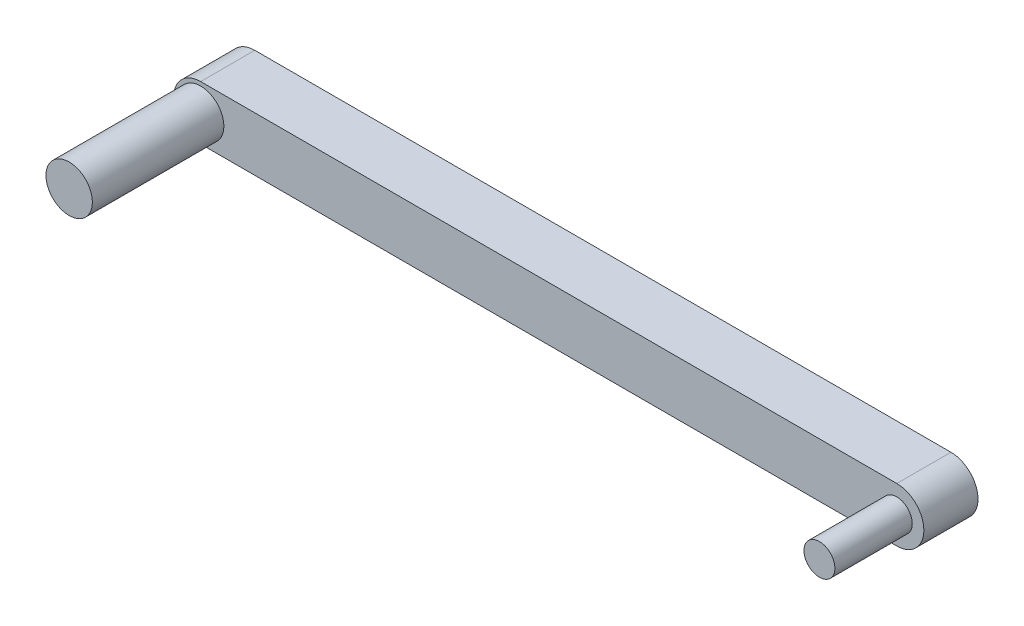
ISO-10303-21;
HEADER;
FILE_DESCRIPTION(('STEP AP214'),'2;1');
FILE_NAME('part.step','',(''),(''),'','','');
FILE_SCHEMA(('AUTOMOTIVE_DESIGN { 1 0 10303 214 1 1 1 1 }'));
ENDSEC;
DATA;
#1=APPLICATION_CONTEXT('core data for automotive mechanical design processes');
#2=APPLICATION_PROTOCOL_DEFINITION('international standard','automotive_design',2000,#1);
#3=PRODUCT_CONTEXT('',#1,'mechanical');
#4=PRODUCT('Part','Part','',(#3));
#5=PRODUCT_RELATED_PRODUCT_CATEGORY('part','',(#4));
#6=PRODUCT_DEFINITION_FORMATION('','',#4);
#7=PRODUCT_DEFINITION_CONTEXT('part definition',#1,'design');
#8=PRODUCT_DEFINITION('design','',#6,#7);
#9=PRODUCT_DEFINITION_SHAPE('','',#8);
#10=(LENGTH_UNIT() NAMED_UNIT(*) SI_UNIT(.MILLI.,.METRE.));
#11=(NAMED_UNIT(*) PLANE_ANGLE_UNIT() SI_UNIT($,.RADIAN.));
#12=(NAMED_UNIT(*) SI_UNIT($,.STERADIAN.) SOLID_ANGLE_UNIT());
#13=UNCERTAINTY_MEASURE_WITH_UNIT(LENGTH_MEASURE(1.E-05),#10,'distance_accuracy_value','');
#14=(GEOMETRIC_REPRESENTATION_CONTEXT(3) GLOBAL_UNCERTAINTY_ASSIGNED_CONTEXT((#13)) GLOBAL_UNIT_ASSIGNED_CONTEXT((#10,
#11,#12)) REPRESENTATION_CONTEXT('',''));
#15=CARTESIAN_POINT('',(0.,0.,0.));
#16=DIRECTION('',(0.,0.,1.));
#17=DIRECTION('',(1.,0.,0.));
#18=AXIS2_PLACEMENT_3D('',#15,#16,#17);
#19=CARTESIAN_POINT('',(0.564343354143224,10.1446754614139,3.5));
#20=DIRECTION('',(0.,0.,-1.));
#21=DIRECTION('',(-1.,0.,0.));
#22=AXIS2_PLACEMENT_3D('',#19,#20,#21);
#23=CYLINDRICAL_SURFACE('',#22,1.75);
#24=CARTESIAN_POINT('',(0.564343354143224,10.1446754614139,0.));
#25=DIRECTION('',(0.,0.,1.));
#26=DIRECTION('',(1.,0.,0.));
#27=AXIS2_PLACEMENT_3D('',#24,#25,#26);
#28=CIRCLE('',#27,1.75);
#29=CARTESIAN_POINT('',(0.564343354143224,8.39467546141387,0.));
#30=VERTEX_POINT('',#29);
#31=CARTESIAN_POINT('',(0.564343354143224,11.8946754614139,0.));
#32=VERTEX_POINT('',#31);
#33=EDGE_CURVE('E95',#30,#32,#28,.T.);
#34=ORIENTED_EDGE('',*,*,#33,.T.);
#35=DIRECTION('',(0.,0.,-1.));
#36=VECTOR('',#35,1.);
#37=CARTESIAN_POINT('',(0.564343354143224,11.8946754614139,3.5));
#38=LINE('',#37,#36);
#39=CARTESIAN_POINT('',(0.564343354143224,11.8946754614139,3.5));
#40=VERTEX_POINT('',#39);
#41=EDGE_CURVE('E11',#40,#32,#38,.T.);
#42=ORIENTED_EDGE('',*,*,#41,.F.);
#43=CARTESIAN_POINT('',(0.564343354143224,10.1446754614139,3.5));
#44=DIRECTION('',(0.,0.,1.));
#45=DIRECTION('',(1.,0.,0.));
#46=AXIS2_PLACEMENT_3D('',#43,#44,#45);
#47=CIRCLE('',#46,1.75);
#48=CARTESIAN_POINT('',(0.564343354143224,8.39467546141387,3.5));
#49=VERTEX_POINT('',#48);
#50=EDGE_CURVE('E83',#49,#40,#47,.T.);
#51=ORIENTED_EDGE('',*,*,#50,.F.);
#52=DIRECTION('',(0.,0.,-1.));
#53=VECTOR('',#52,1.);
#54=CARTESIAN_POINT('',(0.564343354143224,8.39467546141387,3.5));
#55=LINE('',#54,#53);
#56=EDGE_CURVE('E91',#49,#30,#55,.T.);
#57=ORIENTED_EDGE('',*,*,#56,.T.);
#58=EDGE_LOOP('',(#34,#42,#51,#57));
#59=FACE_BOUND('',#58,.T.);
#60=ADVANCED_FACE('F32',(#59),#23,.T.);
#61=CARTESIAN_POINT('',(-44.4356566458568,11.8946754614139,3.5));
#62=DIRECTION('',(0.,-1.,0.));
#63=DIRECTION('',(1.,0.,0.));
#64=AXIS2_PLACEMENT_3D('',#61,#62,#63);
#65=PLANE('',#64);
#66=DIRECTION('',(-1.,0.,0.));
#67=VECTOR('',#66,1.);
#68=CARTESIAN_POINT('',(-44.4356566458568,11.8946754614139,0.));
#69=LINE('',#68,#67);
#70=CARTESIAN_POINT('',(-44.4356566458568,11.8946754614139,0.));
#71=VERTEX_POINT('',#70);
#72=EDGE_CURVE('E87',#32,#71,#69,.T.);
#73=ORIENTED_EDGE('',*,*,#72,.T.);
#74=DIRECTION('',(0.,0.,-1.));
#75=VECTOR('',#74,1.);
#76=CARTESIAN_POINT('',(-44.4356566458568,11.8946754614139,3.5));
#77=LINE('',#76,#75);
#78=CARTESIAN_POINT('',(-44.4356566458568,11.8946754614139,3.5));
#79=VERTEX_POINT('',#78);
#80=EDGE_CURVE('E40',#79,#71,#77,.T.);
#81=ORIENTED_EDGE('',*,*,#80,.F.);
#82=DIRECTION('',(-1.,0.,0.));
#83=VECTOR('',#82,1.);
#84=CARTESIAN_POINT('',(-44.4356566458568,11.8946754614139,3.5));
#85=LINE('',#84,#83);
#86=EDGE_CURVE('E78',#40,#79,#85,.T.);
#87=ORIENTED_EDGE('',*,*,#86,.F.);
#88=ORIENTED_EDGE('',*,*,#41,.T.);
#89=EDGE_LOOP('',(#73,#81,#87,#88));
#90=FACE_BOUND('',#89,.T.);
#91=ADVANCED_FACE('F86',(#90),#65,.F.);
#92=CARTESIAN_POINT('',(-44.4356566458568,10.1446754614139,3.5));
#93=DIRECTION('',(0.,0.,-1.));
#94=DIRECTION('',(-1.,0.,0.));
#95=AXIS2_PLACEMENT_3D('',#92,#93,#94);
#96=CYLINDRICAL_SURFACE('',#95,1.75);
#97=CARTESIAN_POINT('',(-44.4356566458568,10.1446754614139,0.));
#98=DIRECTION('',(0.,0.,1.));
#99=DIRECTION('',(1.,0.,0.));
#100=AXIS2_PLACEMENT_3D('',#97,#98,#99);
#101=CIRCLE('',#100,1.75);
#102=CARTESIAN_POINT('',(-44.4356566458568,8.39467546141387,0.));
#103=VERTEX_POINT('',#102);
#104=EDGE_CURVE('E65',#71,#103,#101,.T.);
#105=ORIENTED_EDGE('',*,*,#104,.T.);
#106=DIRECTION('',(0.,0.,-1.));
#107=VECTOR('',#106,1.);
#108=CARTESIAN_POINT('',(-44.4356566458568,8.39467546141387,3.5));
#109=LINE('',#108,#107);
#110=CARTESIAN_POINT('',(-44.4356566458568,8.39467546141387,3.5));
#111=VERTEX_POINT('',#110);
#112=EDGE_CURVE('E88',#111,#103,#109,.T.);
#113=ORIENTED_EDGE('',*,*,#112,.F.);
#114=CARTESIAN_POINT('',(-44.4356566458568,10.1446754614139,3.5));
#115=DIRECTION('',(0.,0.,1.));
#116=DIRECTION('',(1.,0.,0.));
#117=AXIS2_PLACEMENT_3D('',#114,#115,#116);
#118=CIRCLE('',#117,1.75);
#119=EDGE_CURVE('E81',#79,#111,#118,.T.);
#120=ORIENTED_EDGE('',*,*,#119,.F.);
#121=ORIENTED_EDGE('',*,*,#80,.T.);
#122=EDGE_LOOP('',(#105,#113,#120,#121));
#123=FACE_BOUND('',#122,.T.);
#124=ADVANCED_FACE('F89',(#123),#96,.T.);
#125=CARTESIAN_POINT('',(-44.4356566458568,8.39467546141387,3.5));
#126=DIRECTION('',(0.,1.,0.));
#127=DIRECTION('',(0.,0.,1.));
#128=AXIS2_PLACEMENT_3D('',#125,#126,#127);
#129=PLANE('',#128);
#130=DIRECTION('',(1.,0.,0.));
#131=VECTOR('',#130,1.);
#132=CARTESIAN_POINT('',(-44.4356566458568,8.39467546141387,0.));
#133=LINE('',#132,#131);
#134=EDGE_CURVE('E71',#103,#30,#133,.T.);
#135=ORIENTED_EDGE('',*,*,#134,.T.);
#136=ORIENTED_EDGE('',*,*,#56,.F.);
#137=DIRECTION('',(1.,0.,0.));
#138=VECTOR('',#137,1.);
#139=CARTESIAN_POINT('',(-44.4356566458568,8.39467546141387,3.5));
#140=LINE('',#139,#138);
#141=EDGE_CURVE('E48',#111,#49,#140,.T.);
#142=ORIENTED_EDGE('',*,*,#141,.F.);
#143=ORIENTED_EDGE('',*,*,#112,.T.);
#144=EDGE_LOOP('',(#135,#136,#142,#143));
#145=FACE_BOUND('',#144,.T.);
#146=ADVANCED_FACE('F103',(#145),#129,.F.);
#147=CARTESIAN_POINT('',(0.564343354143224,10.1446754614139,3.5));
#148=DIRECTION('',(0.,0.,1.));
#149=DIRECTION('',(1.,0.,0.));
#150=AXIS2_PLACEMENT_3D('',#147,#148,#149);
#151=PLANE('',#150);
#152=CARTESIAN_POINT('',(0.564343354143224,10.1446754614139,3.5));
#153=DIRECTION('',(0.,0.,1.));
#154=DIRECTION('',(1.,0.,0.));
#155=AXIS2_PLACEMENT_3D('',#152,#153,#154);
#156=CIRCLE('',#155,1.);
#157=CARTESIAN_POINT('',(1.56434335414322,10.1446754614139,3.5));
#158=VERTEX_POINT('',#157);
#159=EDGE_CURVE('E115',#158,#158,#156,.T.);
#160=ORIENTED_EDGE('',*,*,#159,.F.);
#161=EDGE_LOOP('',(#160));
#162=FACE_BOUND('',#161,.T.);
#163=CARTESIAN_POINT('',(-44.4356566458568,10.1446754614139,3.5));
#164=DIRECTION('',(0.,0.,1.));
#165=DIRECTION('',(1.,0.,0.));
#166=AXIS2_PLACEMENT_3D('',#163,#164,#165);
#167=CIRCLE('',#166,1.5);
#168=CARTESIAN_POINT('',(-42.9356566458568,10.1446754614139,3.5));
#169=VERTEX_POINT('',#168);
#170=EDGE_CURVE('E109',#169,#169,#167,.T.);
#171=ORIENTED_EDGE('',*,*,#170,.F.);
#172=EDGE_LOOP('',(#171));
#173=FACE_BOUND('',#172,.T.);
#174=ORIENTED_EDGE('',*,*,#50,.T.);
#175=ORIENTED_EDGE('',*,*,#86,.T.);
#176=ORIENTED_EDGE('',*,*,#119,.T.);
#177=ORIENTED_EDGE('',*,*,#141,.T.);
#178=EDGE_LOOP('',(#174,#175,#176,#177));
#179=FACE_BOUND('',#178,.T.);
#180=ADVANCED_FACE('F79',(#162,#173,#179),#151,.T.);
#181=CARTESIAN_POINT('',(0.564343354143224,10.1446754614139,0.));
#182=DIRECTION('',(0.,0.,1.));
#183=DIRECTION('',(1.,0.,0.));
#184=AXIS2_PLACEMENT_3D('',#181,#182,#183);
#185=PLANE('',#184);
#186=ORIENTED_EDGE('',*,*,#33,.F.);
#187=ORIENTED_EDGE('',*,*,#134,.F.);
#188=ORIENTED_EDGE('',*,*,#104,.F.);
#189=ORIENTED_EDGE('',*,*,#72,.F.);
#190=EDGE_LOOP('',(#186,#187,#188,#189));
#191=FACE_BOUND('',#190,.T.);
#192=ADVANCED_FACE('F106',(#191),#185,.F.);
#193=CARTESIAN_POINT('',(-44.4356566458568,10.1446754614139,12.));
#194=DIRECTION('',(0.,0.,-1.));
#195=DIRECTION('',(-1.,0.,0.));
#196=AXIS2_PLACEMENT_3D('',#193,#194,#195);
#197=CYLINDRICAL_SURFACE('',#196,1.5);
#198=CARTESIAN_POINT('',(-44.4356566458568,10.1446754614139,12.));
#199=DIRECTION('',(0.,0.,1.));
#200=DIRECTION('',(1.,0.,0.));
#201=AXIS2_PLACEMENT_3D('',#198,#199,#200);
#202=CIRCLE('',#201,1.5);
#203=CARTESIAN_POINT('',(-42.9356566458568,10.1446754614139,12.));
#204=VERTEX_POINT('',#203);
#205=EDGE_CURVE('E98',#204,#204,#202,.T.);
#206=ORIENTED_EDGE('',*,*,#205,.F.);
#207=EDGE_LOOP('',(#206));
#208=FACE_BOUND('',#207,.T.);
#209=ORIENTED_EDGE('',*,*,#170,.T.);
#210=EDGE_LOOP('',(#209));
#211=FACE_BOUND('',#210,.T.);
#212=ADVANCED_FACE('F135',(#208,#211),#197,.T.);
#213=CARTESIAN_POINT('',(-44.4356566458568,10.1446754614139,12.));
#214=DIRECTION('',(0.,0.,1.));
#215=DIRECTION('',(1.,0.,0.));
#216=AXIS2_PLACEMENT_3D('',#213,#214,#215);
#217=PLANE('',#216);
#218=ORIENTED_EDGE('',*,*,#205,.T.);
#219=EDGE_LOOP('',(#218));
#220=FACE_BOUND('',#219,.T.);
#221=ADVANCED_FACE('F126',(#220),#217,.T.);
#222=CARTESIAN_POINT('',(0.564343354143224,10.1446754614139,8.5));
#223=DIRECTION('',(0.,0.,-1.));
#224=DIRECTION('',(-1.,0.,0.));
#225=AXIS2_PLACEMENT_3D('',#222,#223,#224);
#226=CYLINDRICAL_SURFACE('',#225,1.);
#227=CARTESIAN_POINT('',(0.564343354143224,10.1446754614139,8.5));
#228=DIRECTION('',(0.,0.,1.));
#229=DIRECTION('',(1.,0.,0.));
#230=AXIS2_PLACEMENT_3D('',#227,#228,#229);
#231=CIRCLE('',#230,1.);
#232=CARTESIAN_POINT('',(1.56434335414322,10.1446754614139,8.5));
#233=VERTEX_POINT('',#232);
#234=EDGE_CURVE('E112',#233,#233,#231,.T.);
#235=ORIENTED_EDGE('',*,*,#234,.F.);
#236=EDGE_LOOP('',(#235));
#237=FACE_BOUND('',#236,.T.);
#238=ORIENTED_EDGE('',*,*,#159,.T.);
#239=EDGE_LOOP('',(#238));
#240=FACE_BOUND('',#239,.T.);
#241=ADVANCED_FACE('F123',(#237,#240),#226,.T.);
#242=CARTESIAN_POINT('',(0.564343354143224,10.1446754614139,8.5));
#243=DIRECTION('',(0.,0.,1.));
#244=DIRECTION('',(1.,0.,0.));
#245=AXIS2_PLACEMENT_3D('',#242,#243,#244);
#246=PLANE('',#245);
#247=ORIENTED_EDGE('',*,*,#234,.T.);
#248=EDGE_LOOP('',(#247));
#249=FACE_BOUND('',#248,.T.);
#250=ADVANCED_FACE('F121',(#249),#246,.T.);
#251=CLOSED_SHELL('',(#60,#91,#124,#146,#180,#192,#212,#221,#241,#250));
#252=MANIFOLD_SOLID_BREP('B2',#251);
#253=ADVANCED_BREP_SHAPE_REPRESENTATION('',(#18,#252),#14);
#254=SHAPE_DEFINITION_REPRESENTATION(#9,#253);
ENDSEC;
END-ISO-10303-21;
